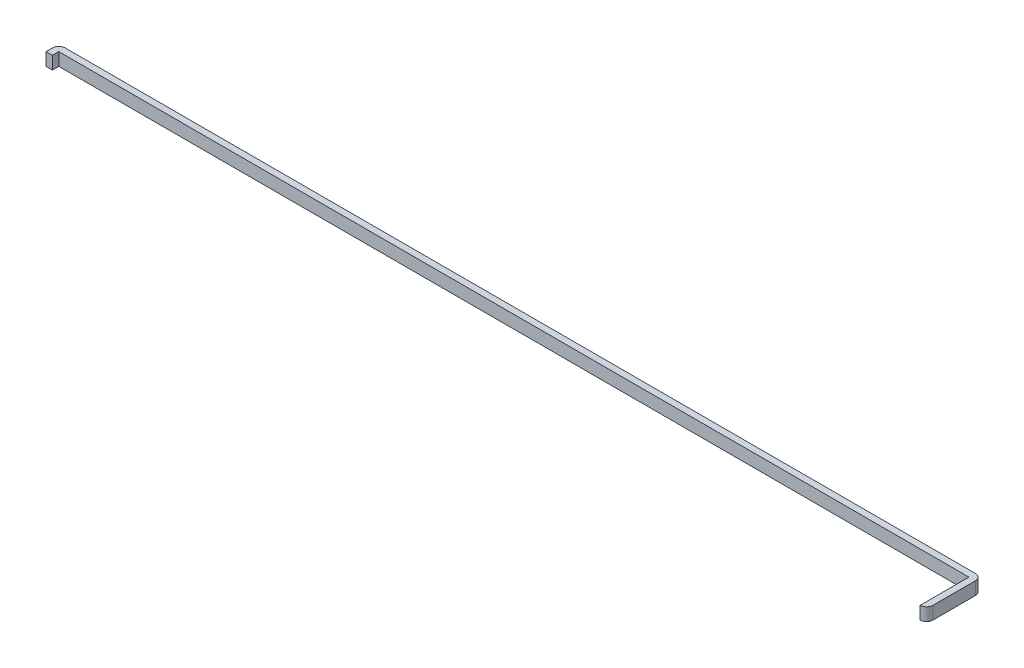
ISO-10303-21;
HEADER;
FILE_DESCRIPTION(('STEP AP214'),'2;1');
FILE_NAME('part.step','',(''),(''),'','','');
FILE_SCHEMA(('AUTOMOTIVE_DESIGN { 1 0 10303 214 1 1 1 1 }'));
ENDSEC;
DATA;
#1=APPLICATION_CONTEXT('core data for automotive mechanical design processes');
#2=APPLICATION_PROTOCOL_DEFINITION('international standard','automotive_design',2000,#1);
#3=PRODUCT_CONTEXT('',#1,'mechanical');
#4=PRODUCT('Part','Part','',(#3));
#5=PRODUCT_RELATED_PRODUCT_CATEGORY('part','',(#4));
#6=PRODUCT_DEFINITION_FORMATION('','',#4);
#7=PRODUCT_DEFINITION_CONTEXT('part definition',#1,'design');
#8=PRODUCT_DEFINITION('design','',#6,#7);
#9=PRODUCT_DEFINITION_SHAPE('','',#8);
#10=(LENGTH_UNIT() NAMED_UNIT(*) SI_UNIT(.MILLI.,.METRE.));
#11=(NAMED_UNIT(*) PLANE_ANGLE_UNIT() SI_UNIT($,.RADIAN.));
#12=(NAMED_UNIT(*) SI_UNIT($,.STERADIAN.) SOLID_ANGLE_UNIT());
#13=UNCERTAINTY_MEASURE_WITH_UNIT(LENGTH_MEASURE(1.E-05),#10,'distance_accuracy_value','');
#14=(GEOMETRIC_REPRESENTATION_CONTEXT(3) GLOBAL_UNCERTAINTY_ASSIGNED_CONTEXT((#13)) GLOBAL_UNIT_ASSIGNED_CONTEXT((#10,
#11,#12)) REPRESENTATION_CONTEXT('',''));
#15=CARTESIAN_POINT('',(0.,0.,0.));
#16=DIRECTION('',(0.,0.,1.));
#17=DIRECTION('',(1.,0.,0.));
#18=AXIS2_PLACEMENT_3D('',#15,#16,#17);
#19=CARTESIAN_POINT('',(-14.224,-0.20019,0.20019));
#20=DIRECTION('',(0.,0.,-1.));
#21=DIRECTION('',(-1.,0.,0.));
#22=AXIS2_PLACEMENT_3D('',#19,#20,#21);
#23=PLANE('',#22);
#24=DIRECTION('',(0.,1.,0.));
#25=VECTOR('',#24,1.);
#26=CARTESIAN_POINT('',(14.224,-0.20019,0.20019));
#27=LINE('',#26,#25);
#28=CARTESIAN_POINT('',(14.224,-0.20019,0.20019));
#29=VERTEX_POINT('',#28);
#30=CARTESIAN_POINT('',(14.224,0.20019,0.20019));
#31=VERTEX_POINT('',#30);
#32=EDGE_CURVE('E125',#29,#31,#27,.T.);
#33=ORIENTED_EDGE('',*,*,#32,.T.);
#34=DIRECTION('',(1.,0.,0.));
#35=VECTOR('',#34,1.);
#36=CARTESIAN_POINT('',(14.224,0.20019,0.20019));
#37=LINE('',#36,#35);
#38=CARTESIAN_POINT('',(-14.224,0.20019,0.20019));
#39=VERTEX_POINT('',#38);
#40=EDGE_CURVE('E112',#31,#39,#37,.F.);
#41=ORIENTED_EDGE('',*,*,#40,.T.);
#42=DIRECTION('',(0.,1.,0.));
#43=VECTOR('',#42,1.);
#44=CARTESIAN_POINT('',(-14.224,-0.20019,0.20019));
#45=LINE('',#44,#43);
#46=CARTESIAN_POINT('',(-14.224,-0.20019,0.20019));
#47=VERTEX_POINT('',#46);
#48=EDGE_CURVE('E108',#39,#47,#45,.F.);
#49=ORIENTED_EDGE('',*,*,#48,.T.);
#50=DIRECTION('',(1.,0.,0.));
#51=VECTOR('',#50,1.);
#52=CARTESIAN_POINT('',(14.224,-0.20019,0.20019));
#53=LINE('',#52,#51);
#54=EDGE_CURVE('E126',#29,#47,#53,.F.);
#55=ORIENTED_EDGE('',*,*,#54,.F.);
#56=EDGE_LOOP('',(#33,#41,#49,#55));
#57=FACE_BOUND('',#56,.T.);
#58=ADVANCED_FACE('F17',(#57),#23,.F.);
#59=CARTESIAN_POINT('',(-14.224,-0.20019,0.40038));
#60=DIRECTION('',(-1.,0.,0.));
#61=DIRECTION('',(0.,0.,1.));
#62=AXIS2_PLACEMENT_3D('',#59,#60,#61);
#63=PLANE('',#62);
#64=ORIENTED_EDGE('',*,*,#48,.F.);
#65=DIRECTION('',(0.,0.,-1.));
#66=VECTOR('',#65,1.);
#67=CARTESIAN_POINT('',(-14.224,0.20019,0.20019));
#68=LINE('',#67,#66);
#69=CARTESIAN_POINT('',(-14.224,0.20019,0.40038));
#70=VERTEX_POINT('',#69);
#71=EDGE_CURVE('E120',#39,#70,#68,.F.);
#72=ORIENTED_EDGE('',*,*,#71,.T.);
#73=DIRECTION('',(0.,1.,0.));
#74=VECTOR('',#73,1.);
#75=CARTESIAN_POINT('',(-14.224,-0.20019,0.40038));
#76=LINE('',#75,#74);
#77=CARTESIAN_POINT('',(-14.224,-0.20019,0.40038));
#78=VERTEX_POINT('',#77);
#79=EDGE_CURVE('E177',#70,#78,#76,.F.);
#80=ORIENTED_EDGE('',*,*,#79,.T.);
#81=DIRECTION('',(0.,0.,-1.));
#82=VECTOR('',#81,1.);
#83=CARTESIAN_POINT('',(-14.224,-0.20019,0.20019));
#84=LINE('',#83,#82);
#85=EDGE_CURVE('E168',#47,#78,#84,.F.);
#86=ORIENTED_EDGE('',*,*,#85,.F.);
#87=EDGE_LOOP('',(#64,#72,#80,#86));
#88=FACE_BOUND('',#87,.T.);
#89=ADVANCED_FACE('F227',(#88),#63,.F.);
#90=CARTESIAN_POINT('',(-14.42419,-0.20019,0.40038));
#91=DIRECTION('',(0.,0.,-1.));
#92=DIRECTION('',(-1.,0.,0.));
#93=AXIS2_PLACEMENT_3D('',#90,#91,#92);
#94=PLANE('',#93);
#95=ORIENTED_EDGE('',*,*,#79,.F.);
#96=DIRECTION('',(1.,0.,0.));
#97=VECTOR('',#96,1.);
#98=CARTESIAN_POINT('',(14.224,0.20019,0.40038));
#99=LINE('',#98,#97);
#100=CARTESIAN_POINT('',(-14.42419,0.20019,0.40038));
#101=VERTEX_POINT('',#100);
#102=EDGE_CURVE('E145',#70,#101,#99,.F.);
#103=ORIENTED_EDGE('',*,*,#102,.T.);
#104=DIRECTION('',(0.,1.,0.));
#105=VECTOR('',#104,1.);
#106=CARTESIAN_POINT('',(-14.42419,-0.20019,0.40038));
#107=LINE('',#106,#105);
#108=CARTESIAN_POINT('',(-14.42419,-0.20019,0.40038));
#109=VERTEX_POINT('',#108);
#110=EDGE_CURVE('E184',#101,#109,#107,.F.);
#111=ORIENTED_EDGE('',*,*,#110,.T.);
#112=DIRECTION('',(1.,0.,0.));
#113=VECTOR('',#112,1.);
#114=CARTESIAN_POINT('',(14.224,-0.20019,0.40038));
#115=LINE('',#114,#113);
#116=EDGE_CURVE('E86',#78,#109,#115,.F.);
#117=ORIENTED_EDGE('',*,*,#116,.F.);
#118=EDGE_LOOP('',(#95,#103,#111,#117));
#119=FACE_BOUND('',#118,.T.);
#120=ADVANCED_FACE('F226',(#119),#94,.F.);
#121=CARTESIAN_POINT('',(-14.42419,-0.20019,0.20019));
#122=DIRECTION('',(1.,0.,0.));
#123=DIRECTION('',(0.,0.,-1.));
#124=AXIS2_PLACEMENT_3D('',#121,#122,#123);
#125=PLANE('',#124);
#126=ORIENTED_EDGE('',*,*,#110,.F.);
#127=DIRECTION('',(0.,0.,-1.));
#128=VECTOR('',#127,1.);
#129=CARTESIAN_POINT('',(-14.42419,0.20019,0.20019));
#130=LINE('',#129,#128);
#131=CARTESIAN_POINT('',(-14.42419,0.20019,0.20019));
#132=VERTEX_POINT('',#131);
#133=EDGE_CURVE('E148',#101,#132,#130,.T.);
#134=ORIENTED_EDGE('',*,*,#133,.T.);
#135=DIRECTION('',(0.,-1.,0.));
#136=VECTOR('',#135,1.);
#137=CARTESIAN_POINT('',(-14.42419,-0.20019,0.20019));
#138=LINE('',#137,#136);
#139=CARTESIAN_POINT('',(-14.42419,-0.20019,0.20019));
#140=VERTEX_POINT('',#139);
#141=EDGE_CURVE('E134',#140,#132,#138,.F.);
#142=ORIENTED_EDGE('',*,*,#141,.F.);
#143=DIRECTION('',(0.,0.,-1.));
#144=VECTOR('',#143,1.);
#145=CARTESIAN_POINT('',(-14.42419,-0.20019,0.20019));
#146=LINE('',#145,#144);
#147=EDGE_CURVE('E80',#109,#140,#146,.T.);
#148=ORIENTED_EDGE('',*,*,#147,.F.);
#149=EDGE_LOOP('',(#126,#134,#142,#148));
#150=FACE_BOUND('',#149,.T.);
#151=ADVANCED_FACE('F224',(#150),#125,.F.);
#152=CARTESIAN_POINT('',(14.42419,-0.20019,1.524905));
#153=DIRECTION('',(-1.,0.,0.));
#154=DIRECTION('',(0.,0.,1.));
#155=AXIS2_PLACEMENT_3D('',#152,#153,#154);
#156=PLANE('',#155);
#157=DIRECTION('',(0.,-1.,0.));
#158=VECTOR('',#157,1.);
#159=CARTESIAN_POINT('',(14.42419,-0.20019,0.20019));
#160=LINE('',#159,#158);
#161=CARTESIAN_POINT('',(14.42419,0.20019,0.20019));
#162=VERTEX_POINT('',#161);
#163=CARTESIAN_POINT('',(14.42419,-0.20019,0.20019));
#164=VERTEX_POINT('',#163);
#165=EDGE_CURVE('E74',#162,#164,#160,.T.);
#166=ORIENTED_EDGE('',*,*,#165,.F.);
#167=DIRECTION('',(0.,0.,-1.));
#168=VECTOR('',#167,1.);
#169=CARTESIAN_POINT('',(14.42419,0.20019,0.20019));
#170=LINE('',#169,#168);
#171=CARTESIAN_POINT('',(14.42419,0.20019,1.524905));
#172=VERTEX_POINT('',#171);
#173=EDGE_CURVE('E139',#162,#172,#170,.F.);
#174=ORIENTED_EDGE('',*,*,#173,.T.);
#175=DIRECTION('',(0.,-1.,0.));
#176=VECTOR('',#175,1.);
#177=CARTESIAN_POINT('',(14.42419,-0.20019,1.524905));
#178=LINE('',#177,#176);
#179=CARTESIAN_POINT('',(14.42419,-0.20019,1.524905));
#180=VERTEX_POINT('',#179);
#181=EDGE_CURVE('E190',#180,#172,#178,.F.);
#182=ORIENTED_EDGE('',*,*,#181,.F.);
#183=DIRECTION('',(0.,0.,-1.));
#184=VECTOR('',#183,1.);
#185=CARTESIAN_POINT('',(14.42419,-0.20019,0.20019));
#186=LINE('',#185,#184);
#187=EDGE_CURVE('E160',#164,#180,#186,.F.);
#188=ORIENTED_EDGE('',*,*,#187,.F.);
#189=EDGE_LOOP('',(#166,#174,#182,#188));
#190=FACE_BOUND('',#189,.T.);
#191=ADVANCED_FACE('F216',(#190),#156,.F.);
#192=CARTESIAN_POINT('',(14.224,-0.20019,1.524905));
#193=DIRECTION('',(0.,-1.,0.));
#194=DIRECTION('',(0.,0.,-1.));
#195=AXIS2_PLACEMENT_3D('',#192,#193,#194);
#196=CYLINDRICAL_SURFACE('',#195,0.20019);
#197=CARTESIAN_POINT('',(14.224,0.20019,1.524905));
#198=DIRECTION('',(0.,-1.,0.));
#199=DIRECTION('',(0.,0.,-1.));
#200=AXIS2_PLACEMENT_3D('',#197,#198,#199);
#201=CIRCLE('',#200,0.20019);
#202=CARTESIAN_POINT('',(14.224,0.20019,1.725095));
#203=VERTEX_POINT('',#202);
#204=EDGE_CURVE('E135',#172,#203,#201,.T.);
#205=ORIENTED_EDGE('',*,*,#204,.T.);
#206=DIRECTION('',(0.,1.,0.));
#207=VECTOR('',#206,1.);
#208=CARTESIAN_POINT('',(14.224,-0.20019,1.725095));
#209=LINE('',#208,#207);
#210=CARTESIAN_POINT('',(14.224,-0.20019,1.725095));
#211=VERTEX_POINT('',#210);
#212=EDGE_CURVE('E129',#203,#211,#209,.F.);
#213=ORIENTED_EDGE('',*,*,#212,.T.);
#214=CARTESIAN_POINT('',(14.224,-0.20019,1.524905));
#215=DIRECTION('',(0.,-1.,0.));
#216=DIRECTION('',(0.,0.,-1.));
#217=AXIS2_PLACEMENT_3D('',#214,#215,#216);
#218=CIRCLE('',#217,0.20019);
#219=EDGE_CURVE('E156',#180,#211,#218,.T.);
#220=ORIENTED_EDGE('',*,*,#219,.F.);
#221=ORIENTED_EDGE('',*,*,#181,.T.);
#222=EDGE_LOOP('',(#205,#213,#220,#221));
#223=FACE_BOUND('',#222,.T.);
#224=ADVANCED_FACE('F218',(#223),#196,.T.);
#225=CARTESIAN_POINT('',(14.224,-0.20019,0.20019));
#226=DIRECTION('',(1.,0.,0.));
#227=DIRECTION('',(0.,0.,-1.));
#228=AXIS2_PLACEMENT_3D('',#225,#226,#227);
#229=PLANE('',#228);
#230=DIRECTION('',(0.,0.,-1.));
#231=VECTOR('',#230,1.);
#232=CARTESIAN_POINT('',(14.224,-0.20019,0.20019));
#233=LINE('',#232,#231);
#234=EDGE_CURVE('E159',#211,#29,#233,.T.);
#235=ORIENTED_EDGE('',*,*,#234,.F.);
#236=ORIENTED_EDGE('',*,*,#212,.F.);
#237=DIRECTION('',(0.,0.,-1.));
#238=VECTOR('',#237,1.);
#239=CARTESIAN_POINT('',(14.224,0.20019,0.20019));
#240=LINE('',#239,#238);
#241=EDGE_CURVE('E117',#203,#31,#240,.T.);
#242=ORIENTED_EDGE('',*,*,#241,.T.);
#243=ORIENTED_EDGE('',*,*,#32,.F.);
#244=EDGE_LOOP('',(#235,#236,#242,#243));
#245=FACE_BOUND('',#244,.T.);
#246=ADVANCED_FACE('F131',(#245),#229,.F.);
#247=CARTESIAN_POINT('',(14.224,-0.20019,0.20019));
#248=DIRECTION('',(0.,-1.,0.));
#249=DIRECTION('',(0.,0.,-1.));
#250=AXIS2_PLACEMENT_3D('',#247,#248,#249);
#251=CYLINDRICAL_SURFACE('',#250,0.20019);
#252=CARTESIAN_POINT('',(14.224,0.20019,0.20019));
#253=DIRECTION('',(0.,-1.,0.));
#254=DIRECTION('',(0.,0.,-1.));
#255=AXIS2_PLACEMENT_3D('',#252,#253,#254);
#256=CIRCLE('',#255,0.20019);
#257=CARTESIAN_POINT('',(14.224,0.20019,0.));
#258=VERTEX_POINT('',#257);
#259=EDGE_CURVE('E20',#258,#162,#256,.T.);
#260=ORIENTED_EDGE('',*,*,#259,.T.);
#261=ORIENTED_EDGE('',*,*,#165,.T.);
#262=CARTESIAN_POINT('',(14.224,-0.20019,0.20019));
#263=DIRECTION('',(0.,-1.,0.));
#264=DIRECTION('',(0.,0.,-1.));
#265=AXIS2_PLACEMENT_3D('',#262,#263,#264);
#266=CIRCLE('',#265,0.20019);
#267=CARTESIAN_POINT('',(14.224,-0.20019,0.));
#268=VERTEX_POINT('',#267);
#269=EDGE_CURVE('E161',#268,#164,#266,.T.);
#270=ORIENTED_EDGE('',*,*,#269,.F.);
#271=DIRECTION('',(0.,1.,0.));
#272=VECTOR('',#271,1.);
#273=CARTESIAN_POINT('',(14.224,-0.20019,0.));
#274=LINE('',#273,#272);
#275=EDGE_CURVE('E64',#268,#258,#274,.T.);
#276=ORIENTED_EDGE('',*,*,#275,.T.);
#277=EDGE_LOOP('',(#260,#261,#270,#276));
#278=FACE_BOUND('',#277,.T.);
#279=ADVANCED_FACE('F219',(#278),#251,.T.);
#280=CARTESIAN_POINT('',(14.224,0.20019,0.20019));
#281=DIRECTION('',(0.,-1.,0.));
#282=DIRECTION('',(0.,0.,-1.));
#283=AXIS2_PLACEMENT_3D('',#280,#281,#282);
#284=PLANE('',#283);
#285=ORIENTED_EDGE('',*,*,#241,.F.);
#286=ORIENTED_EDGE('',*,*,#204,.F.);
#287=ORIENTED_EDGE('',*,*,#173,.F.);
#288=ORIENTED_EDGE('',*,*,#259,.F.);
#289=DIRECTION('',(1.,0.,0.));
#290=VECTOR('',#289,1.);
#291=CARTESIAN_POINT('',(14.224,0.20019,0.));
#292=LINE('',#291,#290);
#293=CARTESIAN_POINT('',(-14.224,0.20019,0.));
#294=VERTEX_POINT('',#293);
#295=EDGE_CURVE('E204',#258,#294,#292,.F.);
#296=ORIENTED_EDGE('',*,*,#295,.T.);
#297=CARTESIAN_POINT('',(-14.224,0.20019,0.20019));
#298=DIRECTION('',(0.,-1.,0.));
#299=DIRECTION('',(0.,0.,-1.));
#300=AXIS2_PLACEMENT_3D('',#297,#298,#299);
#301=CIRCLE('',#300,0.20019);
#302=EDGE_CURVE('E137',#132,#294,#301,.T.);
#303=ORIENTED_EDGE('',*,*,#302,.F.);
#304=ORIENTED_EDGE('',*,*,#133,.F.);
#305=ORIENTED_EDGE('',*,*,#102,.F.);
#306=ORIENTED_EDGE('',*,*,#71,.F.);
#307=ORIENTED_EDGE('',*,*,#40,.F.);
#308=EDGE_LOOP('',(#285,#286,#287,#288,#296,#303,#304,#305,#306,#307));
#309=FACE_BOUND('',#308,.T.);
#310=ADVANCED_FACE('F114',(#309),#284,.F.);
#311=CARTESIAN_POINT('',(-14.224,-0.20019,0.20019));
#312=DIRECTION('',(0.,-1.,0.));
#313=DIRECTION('',(0.,0.,-1.));
#314=AXIS2_PLACEMENT_3D('',#311,#312,#313);
#315=CYLINDRICAL_SURFACE('',#314,0.20019);
#316=ORIENTED_EDGE('',*,*,#302,.T.);
#317=DIRECTION('',(0.,1.,0.));
#318=VECTOR('',#317,1.);
#319=CARTESIAN_POINT('',(-14.224,-0.20019,0.));
#320=LINE('',#319,#318);
#321=CARTESIAN_POINT('',(-14.224,-0.20019,0.));
#322=VERTEX_POINT('',#321);
#323=EDGE_CURVE('E26',#294,#322,#320,.F.);
#324=ORIENTED_EDGE('',*,*,#323,.T.);
#325=CARTESIAN_POINT('',(-14.224,-0.20019,0.20019));
#326=DIRECTION('',(0.,-1.,0.));
#327=DIRECTION('',(0.,0.,-1.));
#328=AXIS2_PLACEMENT_3D('',#325,#326,#327);
#329=CIRCLE('',#328,0.20019);
#330=EDGE_CURVE('E34',#140,#322,#329,.T.);
#331=ORIENTED_EDGE('',*,*,#330,.F.);
#332=ORIENTED_EDGE('',*,*,#141,.T.);
#333=EDGE_LOOP('',(#316,#324,#331,#332));
#334=FACE_BOUND('',#333,.T.);
#335=ADVANCED_FACE('F221',(#334),#315,.T.);
#336=CARTESIAN_POINT('',(14.224,-0.20019,0.20019));
#337=DIRECTION('',(0.,-1.,0.));
#338=DIRECTION('',(0.,0.,-1.));
#339=AXIS2_PLACEMENT_3D('',#336,#337,#338);
#340=PLANE('',#339);
#341=ORIENTED_EDGE('',*,*,#219,.T.);
#342=ORIENTED_EDGE('',*,*,#234,.T.);
#343=ORIENTED_EDGE('',*,*,#54,.T.);
#344=ORIENTED_EDGE('',*,*,#85,.T.);
#345=ORIENTED_EDGE('',*,*,#116,.T.);
#346=ORIENTED_EDGE('',*,*,#147,.T.);
#347=ORIENTED_EDGE('',*,*,#330,.T.);
#348=DIRECTION('',(1.,0.,0.));
#349=VECTOR('',#348,1.);
#350=CARTESIAN_POINT('',(14.224,-0.20019,0.));
#351=LINE('',#350,#349);
#352=EDGE_CURVE('E11',#322,#268,#351,.T.);
#353=ORIENTED_EDGE('',*,*,#352,.T.);
#354=ORIENTED_EDGE('',*,*,#269,.T.);
#355=ORIENTED_EDGE('',*,*,#187,.T.);
#356=EDGE_LOOP('',(#341,#342,#343,#344,#345,#346,#347,#353,#354,#355));
#357=FACE_BOUND('',#356,.T.);
#358=ADVANCED_FACE('F213',(#357),#340,.T.);
#359=CARTESIAN_POINT('',(14.224,-0.20019,0.));
#360=DIRECTION('',(0.,0.,1.));
#361=DIRECTION('',(1.,0.,0.));
#362=AXIS2_PLACEMENT_3D('',#359,#360,#361);
#363=PLANE('',#362);
#364=ORIENTED_EDGE('',*,*,#323,.F.);
#365=ORIENTED_EDGE('',*,*,#295,.F.);
#366=ORIENTED_EDGE('',*,*,#275,.F.);
#367=ORIENTED_EDGE('',*,*,#352,.F.);
#368=EDGE_LOOP('',(#364,#365,#366,#367));
#369=FACE_BOUND('',#368,.T.);
#370=ADVANCED_FACE('F220',(#369),#363,.F.);
#371=CLOSED_SHELL('',(#58,#89,#120,#151,#191,#224,#246,#279,#310,#335,#358,#370));
#372=MANIFOLD_SOLID_BREP('B1',#371);
#373=ADVANCED_BREP_SHAPE_REPRESENTATION('',(#18,#372),#14);
#374=SHAPE_DEFINITION_REPRESENTATION(#9,#373);
ENDSEC;
END-ISO-10303-21;
